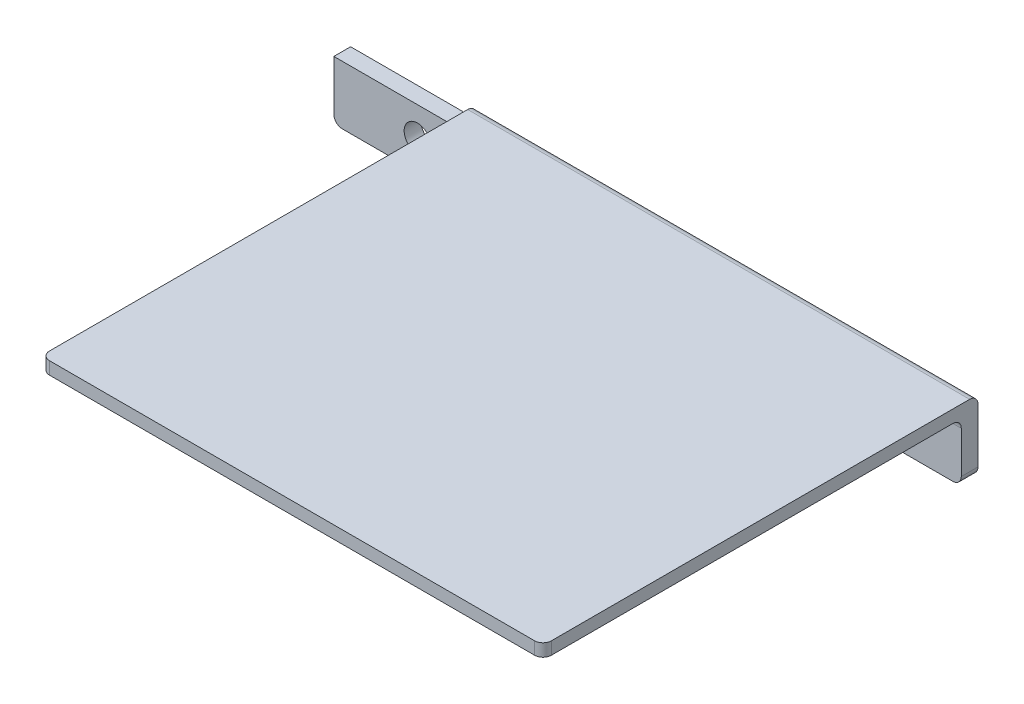
ISO-10303-21;
HEADER;
FILE_DESCRIPTION(('STEP AP214'),'2;1');
FILE_NAME('part.step','',(''),(''),'','','');
FILE_SCHEMA(('AUTOMOTIVE_DESIGN { 1 0 10303 214 1 1 1 1 }'));
ENDSEC;
DATA;
#1=APPLICATION_CONTEXT('core data for automotive mechanical design processes');
#2=APPLICATION_PROTOCOL_DEFINITION('international standard','automotive_design',2000,#1);
#3=PRODUCT_CONTEXT('',#1,'mechanical');
#4=PRODUCT('Part','Part','',(#3));
#5=PRODUCT_RELATED_PRODUCT_CATEGORY('part','',(#4));
#6=PRODUCT_DEFINITION_FORMATION('','',#4);
#7=PRODUCT_DEFINITION_CONTEXT('part definition',#1,'design');
#8=PRODUCT_DEFINITION('design','',#6,#7);
#9=PRODUCT_DEFINITION_SHAPE('','',#8);
#10=(LENGTH_UNIT() NAMED_UNIT(*) SI_UNIT(.MILLI.,.METRE.));
#11=(NAMED_UNIT(*) PLANE_ANGLE_UNIT() SI_UNIT($,.RADIAN.));
#12=(NAMED_UNIT(*) SI_UNIT($,.STERADIAN.) SOLID_ANGLE_UNIT());
#13=UNCERTAINTY_MEASURE_WITH_UNIT(LENGTH_MEASURE(1.E-05),#10,'distance_accuracy_value','');
#14=(GEOMETRIC_REPRESENTATION_CONTEXT(3) GLOBAL_UNCERTAINTY_ASSIGNED_CONTEXT((#13)) GLOBAL_UNIT_ASSIGNED_CONTEXT((#10,
#11,#12)) REPRESENTATION_CONTEXT('',''));
#15=CARTESIAN_POINT('',(0.,0.,0.));
#16=DIRECTION('',(0.,0.,1.));
#17=DIRECTION('',(1.,0.,0.));
#18=AXIS2_PLACEMENT_3D('',#15,#16,#17);
#19=CARTESIAN_POINT('',(0.,0.,2.));
#20=DIRECTION('',(0.,0.,1.));
#21=DIRECTION('',(1.,0.,0.));
#22=AXIS2_PLACEMENT_3D('',#19,#20,#21);
#23=PLANE('',#22);
#24=DIRECTION('',(1.,0.,0.));
#25=VECTOR('',#24,1.);
#26=CARTESIAN_POINT('',(0.,-8.5,2.));
#27=LINE('',#26,#25);
#28=CARTESIAN_POINT('',(1.,-8.5,2.));
#29=VERTEX_POINT('',#28);
#30=CARTESIAN_POINT('',(74.,-8.5,2.));
#31=VERTEX_POINT('',#30);
#32=EDGE_CURVE('E169',#29,#31,#27,.T.);
#33=ORIENTED_EDGE('',*,*,#32,.T.);
#34=CARTESIAN_POINT('',(74.,-7.5,2.));
#35=DIRECTION('',(0.,0.,1.));
#36=DIRECTION('',(1.,0.,0.));
#37=AXIS2_PLACEMENT_3D('',#34,#35,#36);
#38=CIRCLE('',#37,1.);
#39=CARTESIAN_POINT('',(75.,-7.5,2.));
#40=VERTEX_POINT('',#39);
#41=EDGE_CURVE('E234',#31,#40,#38,.T.);
#42=ORIENTED_EDGE('',*,*,#41,.T.);
#43=DIRECTION('',(0.,1.,0.));
#44=VECTOR('',#43,1.);
#45=CARTESIAN_POINT('',(75.,0.,2.));
#46=LINE('',#45,#44);
#47=CARTESIAN_POINT('',(75.,-2.5,2.));
#48=VERTEX_POINT('',#47);
#49=EDGE_CURVE('E167',#40,#48,#46,.T.);
#50=ORIENTED_EDGE('',*,*,#49,.T.);
#51=DIRECTION('',(1.,0.,0.));
#52=VECTOR('',#51,1.);
#53=CARTESIAN_POINT('',(0.,-2.5,2.));
#54=LINE('',#53,#52);
#55=CARTESIAN_POINT('',(15.,-2.5,2.));
#56=VERTEX_POINT('',#55);
#57=EDGE_CURVE('E146',#48,#56,#54,.F.);
#58=ORIENTED_EDGE('',*,*,#57,.T.);
#59=DIRECTION('',(0.,1.,0.));
#60=VECTOR('',#59,1.);
#61=CARTESIAN_POINT('',(15.,0.,2.));
#62=LINE('',#61,#60);
#63=CARTESIAN_POINT('',(15.,-1.5,2.));
#64=VERTEX_POINT('',#63);
#65=EDGE_CURVE('E54',#56,#64,#62,.T.);
#66=ORIENTED_EDGE('',*,*,#65,.T.);
#67=DIRECTION('',(-1.,0.,0.));
#68=VECTOR('',#67,1.);
#69=CARTESIAN_POINT('',(0.,-1.5,2.));
#70=LINE('',#69,#68);
#71=CARTESIAN_POINT('',(0.,-1.5,2.));
#72=VERTEX_POINT('',#71);
#73=EDGE_CURVE('E145',#64,#72,#70,.T.);
#74=ORIENTED_EDGE('',*,*,#73,.T.);
#75=DIRECTION('',(0.,-1.,0.));
#76=VECTOR('',#75,1.);
#77=CARTESIAN_POINT('',(0.,-1.5,2.));
#78=LINE('',#77,#76);
#79=CARTESIAN_POINT('',(0.,-7.5,2.));
#80=VERTEX_POINT('',#79);
#81=EDGE_CURVE('E164',#72,#80,#78,.T.);
#82=ORIENTED_EDGE('',*,*,#81,.T.);
#83=CARTESIAN_POINT('',(1.,-7.5,2.));
#84=DIRECTION('',(0.,0.,1.));
#85=DIRECTION('',(1.,0.,0.));
#86=AXIS2_PLACEMENT_3D('',#83,#84,#85);
#87=CIRCLE('',#86,1.);
#88=EDGE_CURVE('E231',#80,#29,#87,.T.);
#89=ORIENTED_EDGE('',*,*,#88,.T.);
#90=EDGE_LOOP('',(#33,#42,#50,#58,#66,#74,#82,#89));
#91=FACE_BOUND('',#90,.T.);
#92=CARTESIAN_POINT('',(10.,-5.,2.));
#93=DIRECTION('',(0.,0.,1.));
#94=DIRECTION('',(1.,0.,0.));
#95=AXIS2_PLACEMENT_3D('',#92,#93,#94);
#96=CIRCLE('',#95,1.6);
#97=CARTESIAN_POINT('',(11.6,-5.,2.));
#98=VERTEX_POINT('',#97);
#99=EDGE_CURVE('E176',#98,#98,#96,.T.);
#100=ORIENTED_EDGE('',*,*,#99,.F.);
#101=EDGE_LOOP('',(#100));
#102=FACE_BOUND('',#101,.T.);
#103=CARTESIAN_POINT('',(60.,-5.,2.));
#104=DIRECTION('',(0.,0.,1.));
#105=DIRECTION('',(1.,0.,0.));
#106=AXIS2_PLACEMENT_3D('',#103,#104,#105);
#107=CIRCLE('',#106,1.60000000000001);
#108=CARTESIAN_POINT('',(61.6,-5.,2.));
#109=VERTEX_POINT('',#108);
#110=EDGE_CURVE('E260',#109,#109,#107,.T.);
#111=ORIENTED_EDGE('',*,*,#110,.F.);
#112=EDGE_LOOP('',(#111));
#113=FACE_BOUND('',#112,.T.);
#114=ADVANCED_FACE('F41',(#91,#102,#113),#23,.T.);
#115=CARTESIAN_POINT('',(0.,0.,0.));
#116=DIRECTION('',(0.,0.,1.));
#117=DIRECTION('',(1.,0.,0.));
#118=AXIS2_PLACEMENT_3D('',#115,#116,#117);
#119=PLANE('',#118);
#120=DIRECTION('',(0.,-1.,0.));
#121=VECTOR('',#120,1.);
#122=CARTESIAN_POINT('',(15.,0.,0.));
#123=LINE('',#122,#121);
#124=CARTESIAN_POINT('',(15.,-1.,0.));
#125=VERTEX_POINT('',#124);
#126=CARTESIAN_POINT('',(15.,-1.5,0.));
#127=VERTEX_POINT('',#126);
#128=EDGE_CURVE('E160',#125,#127,#123,.T.);
#129=ORIENTED_EDGE('',*,*,#128,.F.);
#130=DIRECTION('',(-1.,0.,0.));
#131=VECTOR('',#130,1.);
#132=CARTESIAN_POINT('',(0.,-1.,0.));
#133=LINE('',#132,#131);
#134=CARTESIAN_POINT('',(75.,-1.,0.));
#135=VERTEX_POINT('',#134);
#136=EDGE_CURVE('E206',#125,#135,#133,.F.);
#137=ORIENTED_EDGE('',*,*,#136,.T.);
#138=DIRECTION('',(0.,1.,0.));
#139=VECTOR('',#138,1.);
#140=CARTESIAN_POINT('',(75.,0.,0.));
#141=LINE('',#140,#139);
#142=CARTESIAN_POINT('',(75.,-7.5,0.));
#143=VERTEX_POINT('',#142);
#144=EDGE_CURVE('E174',#143,#135,#141,.T.);
#145=ORIENTED_EDGE('',*,*,#144,.F.);
#146=CARTESIAN_POINT('',(74.,-7.5,0.));
#147=DIRECTION('',(0.,0.,1.));
#148=DIRECTION('',(1.,0.,0.));
#149=AXIS2_PLACEMENT_3D('',#146,#147,#148);
#150=CIRCLE('',#149,1.);
#151=CARTESIAN_POINT('',(74.,-8.5,0.));
#152=VERTEX_POINT('',#151);
#153=EDGE_CURVE('E204',#143,#152,#150,.F.);
#154=ORIENTED_EDGE('',*,*,#153,.T.);
#155=DIRECTION('',(1.,0.,0.));
#156=VECTOR('',#155,1.);
#157=CARTESIAN_POINT('',(0.,-8.5,0.));
#158=LINE('',#157,#156);
#159=CARTESIAN_POINT('',(1.,-8.5,0.));
#160=VERTEX_POINT('',#159);
#161=EDGE_CURVE('E168',#160,#152,#158,.T.);
#162=ORIENTED_EDGE('',*,*,#161,.F.);
#163=CARTESIAN_POINT('',(1.,-7.5,0.));
#164=DIRECTION('',(0.,0.,1.));
#165=DIRECTION('',(1.,0.,0.));
#166=AXIS2_PLACEMENT_3D('',#163,#164,#165);
#167=CIRCLE('',#166,1.);
#168=CARTESIAN_POINT('',(0.,-7.5,0.));
#169=VERTEX_POINT('',#168);
#170=EDGE_CURVE('E205',#160,#169,#167,.F.);
#171=ORIENTED_EDGE('',*,*,#170,.T.);
#172=DIRECTION('',(0.,-1.,0.));
#173=VECTOR('',#172,1.);
#174=CARTESIAN_POINT('',(0.,-1.5,0.));
#175=LINE('',#174,#173);
#176=CARTESIAN_POINT('',(0.,-1.5,0.));
#177=VERTEX_POINT('',#176);
#178=EDGE_CURVE('E185',#177,#169,#175,.T.);
#179=ORIENTED_EDGE('',*,*,#178,.F.);
#180=DIRECTION('',(-1.,0.,0.));
#181=VECTOR('',#180,1.);
#182=CARTESIAN_POINT('',(0.,-1.5,0.));
#183=LINE('',#182,#181);
#184=EDGE_CURVE('E179',#127,#177,#183,.T.);
#185=ORIENTED_EDGE('',*,*,#184,.F.);
#186=EDGE_LOOP('',(#129,#137,#145,#154,#162,#171,#179,#185));
#187=FACE_BOUND('',#186,.T.);
#188=CARTESIAN_POINT('',(10.,-5.,0.));
#189=DIRECTION('',(0.,0.,1.));
#190=DIRECTION('',(1.,0.,0.));
#191=AXIS2_PLACEMENT_3D('',#188,#189,#190);
#192=CIRCLE('',#191,1.6);
#193=CARTESIAN_POINT('',(11.6,-5.,0.));
#194=VERTEX_POINT('',#193);
#195=EDGE_CURVE('E262',#194,#194,#192,.T.);
#196=ORIENTED_EDGE('',*,*,#195,.T.);
#197=EDGE_LOOP('',(#196));
#198=FACE_BOUND('',#197,.T.);
#199=CARTESIAN_POINT('',(60.,-5.,0.));
#200=DIRECTION('',(0.,0.,1.));
#201=DIRECTION('',(1.,0.,0.));
#202=AXIS2_PLACEMENT_3D('',#199,#200,#201);
#203=CIRCLE('',#202,1.60000000000001);
#204=CARTESIAN_POINT('',(61.6,-5.,0.));
#205=VERTEX_POINT('',#204);
#206=EDGE_CURVE('E255',#205,#205,#203,.T.);
#207=ORIENTED_EDGE('',*,*,#206,.T.);
#208=EDGE_LOOP('',(#207));
#209=FACE_BOUND('',#208,.T.);
#210=ADVANCED_FACE('F269',(#187,#198,#209),#119,.F.);
#211=CARTESIAN_POINT('',(75.,0.,2.));
#212=DIRECTION('',(-1.,0.,0.));
#213=DIRECTION('',(0.,0.,1.));
#214=AXIS2_PLACEMENT_3D('',#211,#212,#213);
#215=PLANE('',#214);
#216=ORIENTED_EDGE('',*,*,#144,.T.);
#217=CARTESIAN_POINT('',(75.,-1.,1.));
#218=DIRECTION('',(-1.,0.,0.));
#219=DIRECTION('',(0.,0.,1.));
#220=AXIS2_PLACEMENT_3D('',#217,#218,#219);
#221=CIRCLE('',#220,1.);
#222=CARTESIAN_POINT('',(75.,0.,1.));
#223=VERTEX_POINT('',#222);
#224=EDGE_CURVE('E213',#135,#223,#221,.F.);
#225=ORIENTED_EDGE('',*,*,#224,.T.);
#226=DIRECTION('',(0.,0.,-1.));
#227=VECTOR('',#226,1.);
#228=CARTESIAN_POINT('',(75.,0.,2.));
#229=LINE('',#228,#227);
#230=CARTESIAN_POINT('',(75.,0.,51.));
#231=VERTEX_POINT('',#230);
#232=EDGE_CURVE('E186',#231,#223,#229,.T.);
#233=ORIENTED_EDGE('',*,*,#232,.F.);
#234=DIRECTION('',(0.,1.,0.));
#235=VECTOR('',#234,1.);
#236=CARTESIAN_POINT('',(75.,-1.5,51.));
#237=LINE('',#236,#235);
#238=CARTESIAN_POINT('',(75.,-1.5,51.));
#239=VERTEX_POINT('',#238);
#240=EDGE_CURVE('E211',#231,#239,#237,.F.);
#241=ORIENTED_EDGE('',*,*,#240,.T.);
#242=DIRECTION('',(0.,0.,-1.));
#243=VECTOR('',#242,1.);
#244=CARTESIAN_POINT('',(75.,-1.5,52.));
#245=LINE('',#244,#243);
#246=CARTESIAN_POINT('',(75.,-1.5,3.));
#247=VERTEX_POINT('',#246);
#248=EDGE_CURVE('E241',#239,#247,#245,.T.);
#249=ORIENTED_EDGE('',*,*,#248,.T.);
#250=CARTESIAN_POINT('',(75.,-2.5,3.));
#251=DIRECTION('',(-1.,0.,0.));
#252=DIRECTION('',(0.,0.,1.));
#253=AXIS2_PLACEMENT_3D('',#250,#251,#252);
#254=CIRCLE('',#253,1.);
#255=EDGE_CURVE('E47',#247,#48,#254,.T.);
#256=ORIENTED_EDGE('',*,*,#255,.T.);
#257=ORIENTED_EDGE('',*,*,#49,.F.);
#258=DIRECTION('',(0.,0.,-1.));
#259=VECTOR('',#258,1.);
#260=CARTESIAN_POINT('',(75.,-7.5,2.));
#261=LINE('',#260,#259);
#262=EDGE_CURVE('E208',#40,#143,#261,.T.);
#263=ORIENTED_EDGE('',*,*,#262,.T.);
#264=EDGE_LOOP('',(#216,#225,#233,#241,#249,#256,#257,#263));
#265=FACE_BOUND('',#264,.T.);
#266=ADVANCED_FACE('F238',(#265),#215,.F.);
#267=CARTESIAN_POINT('',(15.,0.,2.));
#268=DIRECTION('',(0.,-1.,0.));
#269=DIRECTION('',(0.,0.,-1.));
#270=AXIS2_PLACEMENT_3D('',#267,#268,#269);
#271=PLANE('',#270);
#272=ORIENTED_EDGE('',*,*,#232,.T.);
#273=DIRECTION('',(-1.,0.,0.));
#274=VECTOR('',#273,1.);
#275=CARTESIAN_POINT('',(15.,0.,1.));
#276=LINE('',#275,#274);
#277=CARTESIAN_POINT('',(15.,0.,1.));
#278=VERTEX_POINT('',#277);
#279=EDGE_CURVE('E194',#223,#278,#276,.T.);
#280=ORIENTED_EDGE('',*,*,#279,.T.);
#281=DIRECTION('',(0.,0.,-1.));
#282=VECTOR('',#281,1.);
#283=CARTESIAN_POINT('',(15.,0.,2.));
#284=LINE('',#283,#282);
#285=CARTESIAN_POINT('',(15.,0.,51.));
#286=VERTEX_POINT('',#285);
#287=EDGE_CURVE('E159',#286,#278,#284,.T.);
#288=ORIENTED_EDGE('',*,*,#287,.F.);
#289=CARTESIAN_POINT('',(16.,0.,51.));
#290=DIRECTION('',(0.,-1.,0.));
#291=DIRECTION('',(0.,0.,-1.));
#292=AXIS2_PLACEMENT_3D('',#289,#290,#291);
#293=CIRCLE('',#292,1.);
#294=CARTESIAN_POINT('',(16.,0.,52.));
#295=VERTEX_POINT('',#294);
#296=EDGE_CURVE('E193',#286,#295,#293,.F.);
#297=ORIENTED_EDGE('',*,*,#296,.T.);
#298=DIRECTION('',(-1.,0.,0.));
#299=VECTOR('',#298,1.);
#300=CARTESIAN_POINT('',(15.,0.,52.));
#301=LINE('',#300,#299);
#302=CARTESIAN_POINT('',(74.,0.,52.));
#303=VERTEX_POINT('',#302);
#304=EDGE_CURVE('E259',#303,#295,#301,.T.);
#305=ORIENTED_EDGE('',*,*,#304,.F.);
#306=CARTESIAN_POINT('',(74.,0.,51.));
#307=DIRECTION('',(0.,-1.,0.));
#308=DIRECTION('',(0.,0.,-1.));
#309=AXIS2_PLACEMENT_3D('',#306,#307,#308);
#310=CIRCLE('',#309,1.);
#311=EDGE_CURVE('E191',#303,#231,#310,.F.);
#312=ORIENTED_EDGE('',*,*,#311,.T.);
#313=EDGE_LOOP('',(#272,#280,#288,#297,#305,#312));
#314=FACE_BOUND('',#313,.T.);
#315=ADVANCED_FACE('F305',(#314),#271,.F.);
#316=CARTESIAN_POINT('',(15.,0.,2.));
#317=DIRECTION('',(1.,0.,0.));
#318=DIRECTION('',(0.,0.,-1.));
#319=AXIS2_PLACEMENT_3D('',#316,#317,#318);
#320=PLANE('',#319);
#321=ORIENTED_EDGE('',*,*,#287,.T.);
#322=CARTESIAN_POINT('',(15.,-1.,1.));
#323=DIRECTION('',(1.,0.,0.));
#324=DIRECTION('',(0.,0.,-1.));
#325=AXIS2_PLACEMENT_3D('',#322,#323,#324);
#326=CIRCLE('',#325,1.);
#327=EDGE_CURVE('E199',#278,#125,#326,.F.);
#328=ORIENTED_EDGE('',*,*,#327,.T.);
#329=ORIENTED_EDGE('',*,*,#128,.T.);
#330=DIRECTION('',(0.,0.,-1.));
#331=VECTOR('',#330,1.);
#332=CARTESIAN_POINT('',(15.,-1.5,2.));
#333=LINE('',#332,#331);
#334=EDGE_CURVE('E153',#64,#127,#333,.T.);
#335=ORIENTED_EDGE('',*,*,#334,.F.);
#336=ORIENTED_EDGE('',*,*,#65,.F.);
#337=CARTESIAN_POINT('',(15.,-2.5,3.));
#338=DIRECTION('',(1.,0.,0.));
#339=DIRECTION('',(0.,0.,-1.));
#340=AXIS2_PLACEMENT_3D('',#337,#338,#339);
#341=CIRCLE('',#340,1.);
#342=CARTESIAN_POINT('',(15.,-1.5,3.));
#343=VERTEX_POINT('',#342);
#344=EDGE_CURVE('E11',#56,#343,#341,.T.);
#345=ORIENTED_EDGE('',*,*,#344,.T.);
#346=DIRECTION('',(0.,0.,-1.));
#347=VECTOR('',#346,1.);
#348=CARTESIAN_POINT('',(15.,-1.5,52.));
#349=LINE('',#348,#347);
#350=CARTESIAN_POINT('',(15.,-1.5,51.));
#351=VERTEX_POINT('',#350);
#352=EDGE_CURVE('E247',#351,#343,#349,.T.);
#353=ORIENTED_EDGE('',*,*,#352,.F.);
#354=DIRECTION('',(0.,-1.,0.));
#355=VECTOR('',#354,1.);
#356=CARTESIAN_POINT('',(15.,0.,51.));
#357=LINE('',#356,#355);
#358=EDGE_CURVE('E196',#351,#286,#357,.F.);
#359=ORIENTED_EDGE('',*,*,#358,.T.);
#360=EDGE_LOOP('',(#321,#328,#329,#335,#336,#345,#353,#359));
#361=FACE_BOUND('',#360,.T.);
#362=ADVANCED_FACE('F154',(#361),#320,.F.);
#363=CARTESIAN_POINT('',(0.,-1.5,2.));
#364=DIRECTION('',(0.,-1.,0.));
#365=DIRECTION('',(0.,0.,-1.));
#366=AXIS2_PLACEMENT_3D('',#363,#364,#365);
#367=PLANE('',#366);
#368=ORIENTED_EDGE('',*,*,#184,.T.);
#369=DIRECTION('',(0.,0.,-1.));
#370=VECTOR('',#369,1.);
#371=CARTESIAN_POINT('',(0.,-1.5,2.));
#372=LINE('',#371,#370);
#373=EDGE_CURVE('E161',#72,#177,#372,.T.);
#374=ORIENTED_EDGE('',*,*,#373,.F.);
#375=ORIENTED_EDGE('',*,*,#73,.F.);
#376=ORIENTED_EDGE('',*,*,#334,.T.);
#377=EDGE_LOOP('',(#368,#374,#375,#376));
#378=FACE_BOUND('',#377,.T.);
#379=ADVANCED_FACE('F162',(#378),#367,.F.);
#380=CARTESIAN_POINT('',(0.,-1.5,2.));
#381=DIRECTION('',(1.,0.,0.));
#382=DIRECTION('',(0.,1.,0.));
#383=AXIS2_PLACEMENT_3D('',#380,#381,#382);
#384=PLANE('',#383);
#385=ORIENTED_EDGE('',*,*,#178,.T.);
#386=DIRECTION('',(0.,0.,-1.));
#387=VECTOR('',#386,1.);
#388=CARTESIAN_POINT('',(0.,-7.5,2.));
#389=LINE('',#388,#387);
#390=EDGE_CURVE('E61',#169,#80,#389,.F.);
#391=ORIENTED_EDGE('',*,*,#390,.T.);
#392=ORIENTED_EDGE('',*,*,#81,.F.);
#393=ORIENTED_EDGE('',*,*,#373,.T.);
#394=EDGE_LOOP('',(#385,#391,#392,#393));
#395=FACE_BOUND('',#394,.T.);
#396=ADVANCED_FACE('F284',(#395),#384,.F.);
#397=CARTESIAN_POINT('',(0.,-8.5,2.));
#398=DIRECTION('',(0.,1.,0.));
#399=DIRECTION('',(0.,0.,1.));
#400=AXIS2_PLACEMENT_3D('',#397,#398,#399);
#401=PLANE('',#400);
#402=ORIENTED_EDGE('',*,*,#161,.T.);
#403=DIRECTION('',(0.,0.,-1.));
#404=VECTOR('',#403,1.);
#405=CARTESIAN_POINT('',(74.,-8.5,2.));
#406=LINE('',#405,#404);
#407=EDGE_CURVE('E147',#152,#31,#406,.F.);
#408=ORIENTED_EDGE('',*,*,#407,.T.);
#409=ORIENTED_EDGE('',*,*,#32,.F.);
#410=DIRECTION('',(0.,0.,-1.));
#411=VECTOR('',#410,1.);
#412=CARTESIAN_POINT('',(1.,-8.5,2.));
#413=LINE('',#412,#411);
#414=EDGE_CURVE('E226',#29,#160,#413,.T.);
#415=ORIENTED_EDGE('',*,*,#414,.T.);
#416=EDGE_LOOP('',(#402,#408,#409,#415));
#417=FACE_BOUND('',#416,.T.);
#418=ADVANCED_FACE('F277',(#417),#401,.F.);
#419=CARTESIAN_POINT('',(10.,-5.,2.));
#420=DIRECTION('',(0.,0.,-1.));
#421=DIRECTION('',(-1.,0.,0.));
#422=AXIS2_PLACEMENT_3D('',#419,#420,#421);
#423=CYLINDRICAL_SURFACE('',#422,1.6);
#424=ORIENTED_EDGE('',*,*,#99,.T.);
#425=EDGE_LOOP('',(#424));
#426=FACE_BOUND('',#425,.T.);
#427=ORIENTED_EDGE('',*,*,#195,.F.);
#428=EDGE_LOOP('',(#427));
#429=FACE_BOUND('',#428,.T.);
#430=ADVANCED_FACE('F272',(#426,#429),#423,.F.);
#431=CARTESIAN_POINT('',(60.,-5.,2.));
#432=DIRECTION('',(0.,0.,-1.));
#433=DIRECTION('',(-1.,0.,0.));
#434=AXIS2_PLACEMENT_3D('',#431,#432,#433);
#435=CYLINDRICAL_SURFACE('',#434,1.60000000000001);
#436=ORIENTED_EDGE('',*,*,#110,.T.);
#437=EDGE_LOOP('',(#436));
#438=FACE_BOUND('',#437,.T.);
#439=ORIENTED_EDGE('',*,*,#206,.F.);
#440=EDGE_LOOP('',(#439));
#441=FACE_BOUND('',#440,.T.);
#442=ADVANCED_FACE('F274',(#438,#441),#435,.F.);
#443=CARTESIAN_POINT('',(15.,-1.5,52.));
#444=DIRECTION('',(0.,1.,0.));
#445=DIRECTION('',(-1.,0.,0.));
#446=AXIS2_PLACEMENT_3D('',#443,#444,#445);
#447=PLANE('',#446);
#448=ORIENTED_EDGE('',*,*,#248,.F.);
#449=CARTESIAN_POINT('',(74.,-1.5,51.));
#450=DIRECTION('',(0.,1.,0.));
#451=DIRECTION('',(-1.,0.,0.));
#452=AXIS2_PLACEMENT_3D('',#449,#450,#451);
#453=CIRCLE('',#452,1.);
#454=CARTESIAN_POINT('',(74.,-1.5,52.));
#455=VERTEX_POINT('',#454);
#456=EDGE_CURVE('E228',#239,#455,#453,.F.);
#457=ORIENTED_EDGE('',*,*,#456,.T.);
#458=DIRECTION('',(1.,0.,0.));
#459=VECTOR('',#458,1.);
#460=CARTESIAN_POINT('',(15.,-1.5,52.));
#461=LINE('',#460,#459);
#462=CARTESIAN_POINT('',(16.,-1.5,52.));
#463=VERTEX_POINT('',#462);
#464=EDGE_CURVE('E349',#463,#455,#461,.T.);
#465=ORIENTED_EDGE('',*,*,#464,.F.);
#466=CARTESIAN_POINT('',(16.,-1.5,51.));
#467=DIRECTION('',(0.,1.,0.));
#468=DIRECTION('',(-1.,0.,0.));
#469=AXIS2_PLACEMENT_3D('',#466,#467,#468);
#470=CIRCLE('',#469,1.);
#471=EDGE_CURVE('E221',#463,#351,#470,.F.);
#472=ORIENTED_EDGE('',*,*,#471,.T.);
#473=ORIENTED_EDGE('',*,*,#352,.T.);
#474=DIRECTION('',(1.,0.,0.));
#475=VECTOR('',#474,1.);
#476=CARTESIAN_POINT('',(15.,-1.5,3.));
#477=LINE('',#476,#475);
#478=EDGE_CURVE('E222',#343,#247,#477,.T.);
#479=ORIENTED_EDGE('',*,*,#478,.T.);
#480=EDGE_LOOP('',(#448,#457,#465,#472,#473,#479));
#481=FACE_BOUND('',#480,.T.);
#482=ADVANCED_FACE('F252',(#481),#447,.F.);
#483=CARTESIAN_POINT('',(0.,0.,52.));
#484=DIRECTION('',(0.,0.,1.));
#485=DIRECTION('',(1.,0.,0.));
#486=AXIS2_PLACEMENT_3D('',#483,#484,#485);
#487=PLANE('',#486);
#488=ORIENTED_EDGE('',*,*,#464,.T.);
#489=DIRECTION('',(0.,1.,0.));
#490=VECTOR('',#489,1.);
#491=CARTESIAN_POINT('',(74.,0.,52.));
#492=LINE('',#491,#490);
#493=EDGE_CURVE('E217',#455,#303,#492,.T.);
#494=ORIENTED_EDGE('',*,*,#493,.T.);
#495=ORIENTED_EDGE('',*,*,#304,.T.);
#496=DIRECTION('',(0.,-1.,0.));
#497=VECTOR('',#496,1.);
#498=CARTESIAN_POINT('',(16.,-1.5,52.));
#499=LINE('',#498,#497);
#500=EDGE_CURVE('E214',#295,#463,#499,.T.);
#501=ORIENTED_EDGE('',*,*,#500,.T.);
#502=EDGE_LOOP('',(#488,#494,#495,#501));
#503=FACE_BOUND('',#502,.T.);
#504=ADVANCED_FACE('F315',(#503),#487,.T.);
#505=CARTESIAN_POINT('',(15.,-1.,1.));
#506=DIRECTION('',(-1.,0.,0.));
#507=DIRECTION('',(0.,0.,1.));
#508=AXIS2_PLACEMENT_3D('',#505,#506,#507);
#509=CYLINDRICAL_SURFACE('',#508,1.);
#510=ORIENTED_EDGE('',*,*,#224,.F.);
#511=ORIENTED_EDGE('',*,*,#136,.F.);
#512=ORIENTED_EDGE('',*,*,#327,.F.);
#513=ORIENTED_EDGE('',*,*,#279,.F.);
#514=EDGE_LOOP('',(#510,#511,#512,#513));
#515=FACE_BOUND('',#514,.T.);
#516=ADVANCED_FACE('F306',(#515),#509,.T.);
#517=CARTESIAN_POINT('',(74.,0.,51.));
#518=DIRECTION('',(0.,-1.,0.));
#519=DIRECTION('',(0.,0.,-1.));
#520=AXIS2_PLACEMENT_3D('',#517,#518,#519);
#521=CYLINDRICAL_SURFACE('',#520,1.);
#522=ORIENTED_EDGE('',*,*,#456,.F.);
#523=ORIENTED_EDGE('',*,*,#240,.F.);
#524=ORIENTED_EDGE('',*,*,#311,.F.);
#525=ORIENTED_EDGE('',*,*,#493,.F.);
#526=EDGE_LOOP('',(#522,#523,#524,#525));
#527=FACE_BOUND('',#526,.T.);
#528=ADVANCED_FACE('F313',(#527),#521,.T.);
#529=CARTESIAN_POINT('',(16.,0.,51.));
#530=DIRECTION('',(0.,1.,0.));
#531=DIRECTION('',(0.,0.,1.));
#532=AXIS2_PLACEMENT_3D('',#529,#530,#531);
#533=CYLINDRICAL_SURFACE('',#532,1.);
#534=ORIENTED_EDGE('',*,*,#296,.F.);
#535=ORIENTED_EDGE('',*,*,#358,.F.);
#536=ORIENTED_EDGE('',*,*,#471,.F.);
#537=ORIENTED_EDGE('',*,*,#500,.F.);
#538=EDGE_LOOP('',(#534,#535,#536,#537));
#539=FACE_BOUND('',#538,.T.);
#540=ADVANCED_FACE('F316',(#539),#533,.T.);
#541=CARTESIAN_POINT('',(74.,-7.5,2.));
#542=DIRECTION('',(0.,0.,-1.));
#543=DIRECTION('',(-1.,0.,0.));
#544=AXIS2_PLACEMENT_3D('',#541,#542,#543);
#545=CYLINDRICAL_SURFACE('',#544,1.);
#546=ORIENTED_EDGE('',*,*,#41,.F.);
#547=ORIENTED_EDGE('',*,*,#407,.F.);
#548=ORIENTED_EDGE('',*,*,#153,.F.);
#549=ORIENTED_EDGE('',*,*,#262,.F.);
#550=EDGE_LOOP('',(#546,#547,#548,#549));
#551=FACE_BOUND('',#550,.T.);
#552=ADVANCED_FACE('F319',(#551),#545,.T.);
#553=CARTESIAN_POINT('',(1.,-7.5,2.));
#554=DIRECTION('',(0.,0.,-1.));
#555=DIRECTION('',(-1.,0.,0.));
#556=AXIS2_PLACEMENT_3D('',#553,#554,#555);
#557=CYLINDRICAL_SURFACE('',#556,1.);
#558=ORIENTED_EDGE('',*,*,#88,.F.);
#559=ORIENTED_EDGE('',*,*,#390,.F.);
#560=ORIENTED_EDGE('',*,*,#170,.F.);
#561=ORIENTED_EDGE('',*,*,#414,.F.);
#562=EDGE_LOOP('',(#558,#559,#560,#561));
#563=FACE_BOUND('',#562,.T.);
#564=ADVANCED_FACE('F323',(#563),#557,.T.);
#565=CARTESIAN_POINT('',(15.,-2.5,3.));
#566=DIRECTION('',(1.,0.,0.));
#567=DIRECTION('',(0.,1.,0.));
#568=AXIS2_PLACEMENT_3D('',#565,#566,#567);
#569=CYLINDRICAL_SURFACE('',#568,1.);
#570=ORIENTED_EDGE('',*,*,#344,.F.);
#571=ORIENTED_EDGE('',*,*,#57,.F.);
#572=ORIENTED_EDGE('',*,*,#255,.F.);
#573=ORIENTED_EDGE('',*,*,#478,.F.);
#574=EDGE_LOOP('',(#570,#571,#572,#573));
#575=FACE_BOUND('',#574,.T.);
#576=ADVANCED_FACE('F43',(#575),#569,.F.);
#577=CLOSED_SHELL('',(#114,#210,#266,#315,#362,#379,#396,#418,#430,#442,#482,#504,#516,#528,
#540,#552,#564,#576));
#578=MANIFOLD_SOLID_BREP('B2',#577);
#579=ADVANCED_BREP_SHAPE_REPRESENTATION('',(#18,#578),#14);
#580=SHAPE_DEFINITION_REPRESENTATION(#9,#579);
ENDSEC;
END-ISO-10303-21;
